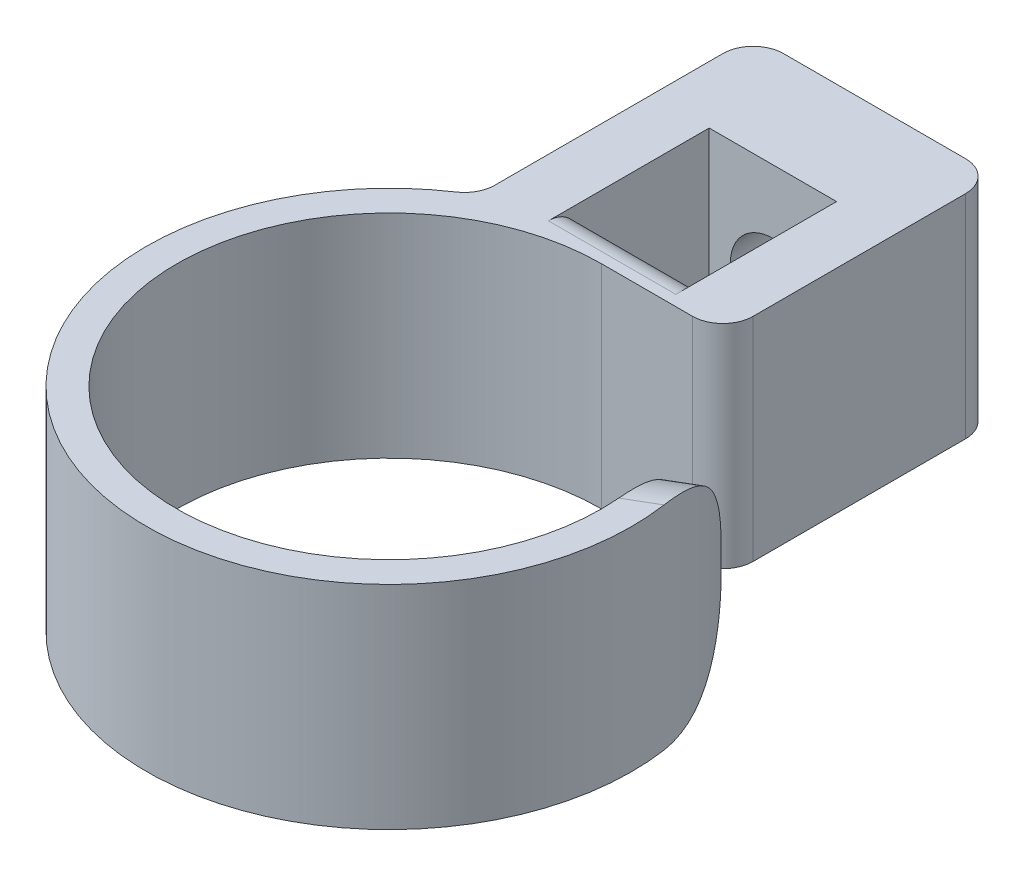
ISO-10303-21;
HEADER;
FILE_DESCRIPTION(('STEP AP214'),'2;1');
FILE_NAME('part.step','',(''),(''),'','','');
FILE_SCHEMA(('AUTOMOTIVE_DESIGN { 1 0 10303 214 1 1 1 1 }'));
ENDSEC;
DATA;
#1=APPLICATION_CONTEXT('core data for automotive mechanical design processes');
#2=APPLICATION_PROTOCOL_DEFINITION('international standard','automotive_design',2000,#1);
#3=PRODUCT_CONTEXT('',#1,'mechanical');
#4=PRODUCT('Part','Part','',(#3));
#5=PRODUCT_RELATED_PRODUCT_CATEGORY('part','',(#4));
#6=PRODUCT_DEFINITION_FORMATION('','',#4);
#7=PRODUCT_DEFINITION_CONTEXT('part definition',#1,'design');
#8=PRODUCT_DEFINITION('design','',#6,#7);
#9=PRODUCT_DEFINITION_SHAPE('','',#8);
#10=(LENGTH_UNIT() NAMED_UNIT(*) SI_UNIT(.MILLI.,.METRE.));
#11=(NAMED_UNIT(*) PLANE_ANGLE_UNIT() SI_UNIT($,.RADIAN.));
#12=(NAMED_UNIT(*) SI_UNIT($,.STERADIAN.) SOLID_ANGLE_UNIT());
#13=UNCERTAINTY_MEASURE_WITH_UNIT(LENGTH_MEASURE(1.E-05),#10,'distance_accuracy_value','');
#14=(GEOMETRIC_REPRESENTATION_CONTEXT(3) GLOBAL_UNCERTAINTY_ASSIGNED_CONTEXT((#13)) GLOBAL_UNIT_ASSIGNED_CONTEXT((#10,
#11,#12)) REPRESENTATION_CONTEXT('',''));
#15=CARTESIAN_POINT('',(0.,0.,0.));
#16=DIRECTION('',(0.,0.,1.));
#17=DIRECTION('',(1.,0.,0.));
#18=AXIS2_PLACEMENT_3D('',#15,#16,#17);
#19=CARTESIAN_POINT('',(-4.,7.,0.));
#20=DIRECTION('',(-1.,0.,0.));
#21=DIRECTION('',(0.,0.,1.));
#22=AXIS2_PLACEMENT_3D('',#19,#20,#21);
#23=PLANE('',#22);
#24=DIRECTION('',(0.,0.,-1.));
#25=VECTOR('',#24,1.);
#26=CARTESIAN_POINT('',(-4.,7.,0.));
#27=LINE('',#26,#25);
#28=CARTESIAN_POINT('',(-4.,7.,-7.48331477354788));
#29=VERTEX_POINT('',#28);
#30=CARTESIAN_POINT('',(-4.,7.,-15.));
#31=VERTEX_POINT('',#30);
#32=EDGE_CURVE('E346',#29,#31,#27,.T.);
#33=ORIENTED_EDGE('',*,*,#32,.T.);
#34=DIRECTION('',(0.,1.,0.));
#35=VECTOR('',#34,1.);
#36=CARTESIAN_POINT('',(-4.,7.,-15.));
#37=LINE('',#36,#35);
#38=CARTESIAN_POINT('',(-4.,0.,-15.));
#39=VERTEX_POINT('',#38);
#40=EDGE_CURVE('E60',#31,#39,#37,.F.);
#41=ORIENTED_EDGE('',*,*,#40,.T.);
#42=DIRECTION('',(0.,0.,-1.));
#43=VECTOR('',#42,1.);
#44=CARTESIAN_POINT('',(-4.,0.,0.));
#45=LINE('',#44,#43);
#46=CARTESIAN_POINT('',(-4.,0.,-7.48331477354788));
#47=VERTEX_POINT('',#46);
#48=EDGE_CURVE('E366',#47,#39,#45,.T.);
#49=ORIENTED_EDGE('',*,*,#48,.F.);
#50=DIRECTION('',(0.,-1.,0.));
#51=VECTOR('',#50,1.);
#52=CARTESIAN_POINT('',(-4.,7.,-7.48331477354788));
#53=LINE('',#52,#51);
#54=EDGE_CURVE('E217',#47,#29,#53,.F.);
#55=ORIENTED_EDGE('',*,*,#54,.T.);
#56=EDGE_LOOP('',(#33,#41,#49,#55));
#57=FACE_BOUND('',#56,.T.);
#58=ADVANCED_FACE('F37',(#57),#23,.T.);
#59=CARTESIAN_POINT('',(0.,7.,0.));
#60=DIRECTION('',(0.,-1.,0.));
#61=DIRECTION('',(0.,0.,-1.));
#62=AXIS2_PLACEMENT_3D('',#59,#60,#61);
#63=CYLINDRICAL_SURFACE('',#62,8.);
#64=CARTESIAN_POINT('',(0.,0.,0.));
#65=DIRECTION('',(0.,1.,0.));
#66=DIRECTION('',(0.,0.,1.));
#67=AXIS2_PLACEMENT_3D('',#64,#65,#66);
#68=CIRCLE('',#67,8.);
#69=CARTESIAN_POINT('',(-4.44444444444444,0.,-6.65183535426479));
#70=VERTEX_POINT('',#69);
#71=CARTESIAN_POINT('',(7.91759521147902,0.,-1.14528863923662));
#72=VERTEX_POINT('',#71);
#73=EDGE_CURVE('E368',#70,#72,#68,.T.);
#74=ORIENTED_EDGE('',*,*,#73,.T.);
#75=CARTESIAN_POINT('',(7.91759521147902,0.,-1.14528863923662));
#76=CARTESIAN_POINT('',(7.90560451927163,-8.44597518646428E-06,-1.2282592034002));
#77=CARTESIAN_POINT('',(7.8922862796158,0.00301990360414861,-1.31105072707906));
#78=CARTESIAN_POINT('',(7.86314843006864,0.0153242345624507,-1.47575337023933));
#79=CARTESIAN_POINT('',(7.84732790709138,0.0246025005860727,-1.55766415664088));
#80=CARTESIAN_POINT('',(7.81334222415321,0.0495853704127475,-1.72005014531417));
#81=CARTESIAN_POINT('',(7.79517623884685,0.0652922406214126,-1.8005248308355));
#82=CARTESIAN_POINT('',(7.75677064645734,0.103197911465341,-1.95938847563758));
#83=CARTESIAN_POINT('',(7.73653133689236,0.125395781499614,-2.03777773214553));
#84=CARTESIAN_POINT('',(7.67303506777772,0.201926061016213,-2.26937627416804));
#85=CARTESIAN_POINT('',(7.62706070282454,0.266152254491046,-2.41873051541854));
#86=CARTESIAN_POINT('',(7.53130184258967,0.419812529417564,-2.70221127227787));
#87=CARTESIAN_POINT('',(7.48152089426593,0.509223347529292,-2.8363516814441));
#88=CARTESIAN_POINT('',(7.3837413819207,0.707447283308147,-3.08175592960648));
#89=CARTESIAN_POINT('',(7.33574120390198,0.815475001521908,-3.1936544370113));
#90=CARTESIAN_POINT('',(7.24337195626956,1.05000762813501,-3.39796596339432));
#91=CARTESIAN_POINT('',(7.19900455337153,1.17652094441761,-3.49037006866241));
#92=CARTESIAN_POINT('',(7.11676546372199,1.44619831655572,-3.65516915309281));
#93=CARTESIAN_POINT('',(7.07898200335396,1.58955091188484,-3.7272992938227));
#94=CARTESIAN_POINT('',(7.01353544956735,1.88763361359476,-3.84904229192971));
#95=CARTESIAN_POINT('',(6.98586985321593,2.04236089474299,-3.89866071893199));
#96=CARTESIAN_POINT('',(6.94663686904038,2.33071753000599,-3.96806183101622));
#97=CARTESIAN_POINT('',(6.93307776603743,2.46318469771166,-3.99158860440259));
#98=CARTESIAN_POINT('',(6.91945848094386,2.66360334631769,-4.01511733898921));
#99=CARTESIAN_POINT('',(6.91603861956929,2.73068987571986,-4.02100001257915));
#100=CARTESIAN_POINT('',(6.91146961057915,2.86517835335375,-4.02884570916185));
#101=CARTESIAN_POINT('',(6.91032078588068,2.93258034507528,-4.03080817474343));
#102=CARTESIAN_POINT('',(6.91032396388709,3.,-4.03080918850394));
#103=B_SPLINE_CURVE_WITH_KNOTS('',3,(#75,#76,#77,#78,#79,#80,#81,#82,#83,#84,#85,#86,#87,#88,
#89,#90,#91,#92,#93,#94,#95,#96,#97,#98,#99,#100,#101,#102),.UNSPECIFIED.,.F.,.F.,(4,2,2,2,2,2,
2,2,2,2,2,2,2,4),(0.,0.251449656288062,0.502991279419703,0.754621660090573,1.00621598271583,
1.51027911472168,2.01387815592746,2.49991424044438,2.98617208296384,3.47851438379895,
3.97073480766565,4.37511974216837,4.57727649136806,4.77946198302534),.UNSPECIFIED.);
#104=CARTESIAN_POINT('',(6.91032396388709,3.,-4.03080918850394));
#105=VERTEX_POINT('',#104);
#106=EDGE_CURVE('E234',#72,#105,#103,.T.);
#107=ORIENTED_EDGE('',*,*,#106,.T.);
#108=DIRECTION('',(0.,-1.,0.));
#109=VECTOR('',#108,1.);
#110=CARTESIAN_POINT('',(6.91032396388709,7.,-4.03080918850394));
#111=LINE('',#110,#109);
#112=CARTESIAN_POINT('',(6.91032396388709,4.,-4.03080918850394));
#113=VERTEX_POINT('',#112);
#114=EDGE_CURVE('E208',#113,#105,#111,.T.);
#115=ORIENTED_EDGE('',*,*,#114,.F.);
#116=CARTESIAN_POINT('',(6.91032396388709,4.,-4.03080918850394));
#117=CARTESIAN_POINT('',(6.91031137850826,4.08426227917581,-4.03081113920035));
#118=CARTESIAN_POINT('',(6.91211243470989,4.16852071869517,-4.02774256557724));
#119=CARTESIAN_POINT('',(6.91924837651607,4.33643689676018,-4.01548179543402));
#120=CARTESIAN_POINT('',(6.92458311349776,4.42009466042004,-4.00628985645609));
#121=CARTESIAN_POINT('',(6.93868940593665,4.58618159740056,-3.98180597810101));
#122=CARTESIAN_POINT('',(6.94745922001372,4.66861137129558,-3.96651712942412));
#123=CARTESIAN_POINT('',(6.96824149904853,4.83167463586952,-3.92989176955191));
#124=CARTESIAN_POINT('',(6.98025392405773,4.9123081486649,-3.90855533286188));
#125=CARTESIAN_POINT('',(7.02082860324577,5.15074937365515,-3.83550795257462));
#126=CARTESIAN_POINT('',(7.05393310686185,5.30515230401606,-3.77475096767341));
#127=CARTESIAN_POINT('',(7.12951874198644,5.60000540940672,-3.62995656649497));
#128=CARTESIAN_POINT('',(7.17199835812645,5.74045783404537,-3.54592291203804));
#129=CARTESIAN_POINT('',(7.26262212697864,6.00267287542991,-3.35637613809782));
#130=CARTESIAN_POINT('',(7.31073182946738,6.12453963048834,-3.2509910349868));
#131=CARTESIAN_POINT('',(7.40892190573647,6.34692245867137,-3.02051547911782));
#132=CARTESIAN_POINT('',(7.45900153506728,6.44744650720505,-2.89543241769515));
#133=CARTESIAN_POINT('',(7.55600455615929,6.62230768530013,-2.63173723779388));
#134=CARTESIAN_POINT('',(7.60297461671302,6.69720884982576,-2.49351589628935));
#135=CARTESIAN_POINT('',(7.69166824187295,6.82253464076962,-2.20477100445936));
#136=CARTESIAN_POINT('',(7.73338998863164,6.87295080357158,-2.05424322119996));
#137=CARTESIAN_POINT('',(7.80106192381985,6.94104699971188,-1.7774506133603));
#138=CARTESIAN_POINT('',(7.82848719787607,6.96335751537216,-1.6526599300598));
#139=CARTESIAN_POINT('',(7.86525987483749,6.98546288789183,-1.46349489605388));
#140=CARTESIAN_POINT('',(7.87678325837459,6.99093807938176,-1.40015572193666));
#141=CARTESIAN_POINT('',(7.89832880796071,6.99820701025326,-1.2730145483506));
#142=CARTESIAN_POINT('',(7.9083510422403,7.00000091700452,-1.20921257005553));
#143=CARTESIAN_POINT('',(7.91759521147902,7.,-1.14528863923662));
#144=B_SPLINE_CURVE_WITH_KNOTS('',3,(#116,#117,#118,#119,#120,#121,#122,#123,#124,#125,#126,
#127,#128,#129,#130,#131,#132,#133,#134,#135,#136,#137,#138,#139,#140,#141,#142,#143),
.UNSPECIFIED.,.F.,.F.,(4,2,2,2,2,2,2,2,2,2,2,2,2,4),(0.,0.252704806970909,0.505398986119791,
0.7579652297711,1.01052836198312,1.51549074516878,2.02037156726487,2.52231039807672,
3.02406133140579,3.51392385134568,4.00395557947049,4.39195345043287,4.58567748827031,
4.77939271824557),.UNSPECIFIED.);
#145=CARTESIAN_POINT('',(7.91759521147902,7.,-1.14528863923662));
#146=VERTEX_POINT('',#145);
#147=EDGE_CURVE('E226',#113,#146,#144,.T.);
#148=ORIENTED_EDGE('',*,*,#147,.T.);
#149=CARTESIAN_POINT('',(0.,7.,0.));
#150=DIRECTION('',(0.,1.,0.));
#151=DIRECTION('',(0.,0.,1.));
#152=AXIS2_PLACEMENT_3D('',#149,#150,#151);
#153=CIRCLE('',#152,8.);
#154=CARTESIAN_POINT('',(-4.44444444444444,7.,-6.65183535426479));
#155=VERTEX_POINT('',#154);
#156=EDGE_CURVE('E348',#155,#146,#153,.T.);
#157=ORIENTED_EDGE('',*,*,#156,.F.);
#158=DIRECTION('',(0.,-1.,0.));
#159=VECTOR('',#158,1.);
#160=CARTESIAN_POINT('',(-4.44444444444444,7.,-6.65183535426479));
#161=LINE('',#160,#159);
#162=EDGE_CURVE('E214',#155,#70,#161,.T.);
#163=ORIENTED_EDGE('',*,*,#162,.T.);
#164=EDGE_LOOP('',(#74,#107,#115,#148,#157,#163));
#165=FACE_BOUND('',#164,.T.);
#166=ADVANCED_FACE('F244',(#165),#63,.T.);
#167=CARTESIAN_POINT('',(0.,7.,0.));
#168=DIRECTION('',(-0.503851148562993,0.,-0.863790495485886));
#169=DIRECTION('',(-0.863790495485886,0.,0.503851148562993));
#170=AXIS2_PLACEMENT_3D('',#167,#168,#169);
#171=PLANE('',#170);
#172=ORIENTED_EDGE('',*,*,#114,.T.);
#173=DIRECTION('',(0.863790495485886,0.,-0.503851148562993));
#174=VECTOR('',#173,1.);
#175=CARTESIAN_POINT('',(6.04653346840121,3.,-3.52695803994095));
#176=LINE('',#175,#174);
#177=CARTESIAN_POINT('',(6.0465334684012,3.,-3.52695803994095));
#178=VERTEX_POINT('',#177);
#179=EDGE_CURVE('E436',#105,#178,#176,.F.);
#180=ORIENTED_EDGE('',*,*,#179,.T.);
#181=DIRECTION('',(0.,-1.,0.));
#182=VECTOR('',#181,1.);
#183=CARTESIAN_POINT('',(6.0465334684012,7.,-3.52695803994095));
#184=LINE('',#183,#182);
#185=CARTESIAN_POINT('',(6.0465334684012,4.,-3.52695803994095));
#186=VERTEX_POINT('',#185);
#187=EDGE_CURVE('E197',#186,#178,#184,.T.);
#188=ORIENTED_EDGE('',*,*,#187,.F.);
#189=DIRECTION('',(0.863790495485886,0.,-0.503851148562993));
#190=VECTOR('',#189,1.);
#191=CARTESIAN_POINT('',(0.,4.,0.));
#192=LINE('',#191,#190);
#193=EDGE_CURVE('E432',#186,#113,#192,.T.);
#194=ORIENTED_EDGE('',*,*,#193,.T.);
#195=EDGE_LOOP('',(#172,#180,#188,#194));
#196=FACE_BOUND('',#195,.T.);
#197=ADVANCED_FACE('F249',(#196),#171,.T.);
#198=CARTESIAN_POINT('',(0.,7.,0.));
#199=DIRECTION('',(0.,-1.,0.));
#200=DIRECTION('',(0.,0.,-1.));
#201=AXIS2_PLACEMENT_3D('',#198,#199,#200);
#202=CYLINDRICAL_SURFACE('',#201,7.);
#203=ORIENTED_EDGE('',*,*,#187,.T.);
#204=CARTESIAN_POINT('',(6.0465334684012,3.,-3.52695803994095));
#205=CARTESIAN_POINT('',(6.04651968899642,2.91577381233204,-3.52695927340141));
#206=CARTESIAN_POINT('',(6.04832037709869,2.83155146664165,-3.52389402371262));
#207=CARTESIAN_POINT('',(6.05544854521157,2.6637065594673,-3.51164276372021));
#208=CARTESIAN_POINT('',(6.0607758832496,2.58008397397573,-3.50245699981044));
#209=CARTESIAN_POINT('',(6.0748522156717,2.41405928718471,-3.47798214491571));
#210=CARTESIAN_POINT('',(6.08359974714309,2.33165667968548,-3.46269566332101));
#211=CARTESIAN_POINT('',(6.10430507233719,2.16864604995579,-3.42606156230433));
#212=CARTESIAN_POINT('',(6.11626282638986,2.08803800556252,-3.40471401778121));
#213=CARTESIAN_POINT('',(6.15659325894473,1.84966640438453,-3.33159289936936));
#214=CARTESIAN_POINT('',(6.1894276145611,1.69530485258129,-3.27073346943398));
#215=CARTESIAN_POINT('',(6.26401554044437,1.40053740410898,-3.12549616997252));
#216=CARTESIAN_POINT('',(6.30576768238665,1.26012927784872,-3.04112206603472));
#217=CARTESIAN_POINT('',(6.39409064125079,0.998273636433291,-2.85070274959846));
#218=CARTESIAN_POINT('',(6.44062253103645,0.876690459003133,-2.74482666309982));
#219=CARTESIAN_POINT('',(6.53453520671374,0.654895171515352,-2.51305140196685));
#220=CARTESIAN_POINT('',(6.5819155198649,0.554671538397376,-2.38716308787005));
#221=CARTESIAN_POINT('',(6.67185401725637,0.380989827039486,-2.12256121370907));
#222=CARTESIAN_POINT('',(6.71451544884917,0.306805975068591,-1.9843585733528));
#223=CARTESIAN_POINT('',(6.79315248582953,0.182378579141993,-1.69571030262528));
#224=CARTESIAN_POINT('',(6.82912397274541,0.132149752841686,-1.54525721201356));
#225=CARTESIAN_POINT('',(6.8865743573531,0.0619923588617948,-1.26192520507928));
#226=CARTESIAN_POINT('',(6.90946256441025,0.0384454322266876,-1.13021087380845));
#227=CARTESIAN_POINT('',(6.93818492493484,0.0152004523818685,-0.930652793655286));
#228=CARTESIAN_POINT('',(6.94681984206951,0.00946448897318101,-0.863851239509058));
#229=CARTESIAN_POINT('',(6.96217783170972,0.00186421966483841,-0.72981864760137));
#230=CARTESIAN_POINT('',(6.96890119852208,-6.82511476698765E-07,-0.662587677585288));
#231=CARTESIAN_POINT('',(6.97464421957056,0.,-0.595262975844205));
#232=B_SPLINE_CURVE_WITH_KNOTS('',3,(#204,#205,#206,#207,#208,#209,#210,#211,#212,#213,#214,
#215,#216,#217,#218,#219,#220,#221,#222,#223,#224,#225,#226,#227,#228,#229,#230,#231),
.UNSPECIFIED.,.F.,.F.,(4,2,2,2,2,2,2,2,2,2,2,2,2,4),(0.,0.252596621915931,0.505183075650633,
0.757661609054684,1.01013702262077,1.51493600459165,2.01965419556458,2.52054637711852,
3.02116764915697,3.5064555157241,3.99204115395302,4.39798825182426,4.60066959443342,
4.8033197148227),.UNSPECIFIED.);
#233=CARTESIAN_POINT('',(6.97464421957056,0.,-0.595262975844205));
#234=VERTEX_POINT('',#233);
#235=EDGE_CURVE('E283',#178,#234,#232,.T.);
#236=ORIENTED_EDGE('',*,*,#235,.T.);
#237=CARTESIAN_POINT('',(0.,0.,0.));
#238=DIRECTION('',(0.,1.,0.));
#239=DIRECTION('',(0.,0.,1.));
#240=AXIS2_PLACEMENT_3D('',#237,#238,#239);
#241=CIRCLE('',#240,7.);
#242=CARTESIAN_POINT('',(0.,0.,-7.));
#243=VERTEX_POINT('',#242);
#244=EDGE_CURVE('E371',#243,#234,#241,.T.);
#245=ORIENTED_EDGE('',*,*,#244,.F.);
#246=DIRECTION('',(0.,-1.,0.));
#247=VECTOR('',#246,1.);
#248=CARTESIAN_POINT('',(0.,7.,-7.));
#249=LINE('',#248,#247);
#250=CARTESIAN_POINT('',(0.,7.,-7.));
#251=VERTEX_POINT('',#250);
#252=EDGE_CURVE('E194',#251,#243,#249,.T.);
#253=ORIENTED_EDGE('',*,*,#252,.F.);
#254=CARTESIAN_POINT('',(0.,7.,0.));
#255=DIRECTION('',(0.,1.,0.));
#256=DIRECTION('',(0.,0.,1.));
#257=AXIS2_PLACEMENT_3D('',#254,#255,#256);
#258=CIRCLE('',#257,7.);
#259=CARTESIAN_POINT('',(6.97464421957056,7.,-0.595262975844204));
#260=VERTEX_POINT('',#259);
#261=EDGE_CURVE('E351',#251,#260,#258,.T.);
#262=ORIENTED_EDGE('',*,*,#261,.T.);
#263=CARTESIAN_POINT('',(6.97464421957056,7.,-0.595262975844205));
#264=CARTESIAN_POINT('',(6.96754128521734,7.00000933953335,-0.678634058521399));
#265=CARTESIAN_POINT('',(6.95891745769304,6.99714268022733,-0.761894622979223));
#266=CARTESIAN_POINT('',(6.93875693526301,6.98542217491795,-0.927675270569818));
#267=CARTESIAN_POINT('',(6.92721886676495,6.97656550228216,-1.01019498546576));
#268=CARTESIAN_POINT('',(6.90135626412383,6.95262055723209,-1.17395470485087));
#269=CARTESIAN_POINT('',(6.88702969320848,6.93752772070847,-1.25519372672642));
#270=CARTESIAN_POINT('',(6.85583226348858,6.90096604418968,-1.4157134675973));
#271=CARTESIAN_POINT('',(6.83896185424422,6.87949833014716,-1.49499452973794));
#272=CARTESIAN_POINT('',(6.80292771182781,6.83004421828268,-1.65124912471061));
#273=CARTESIAN_POINT('',(6.7837570086493,6.80203775224553,-1.72821471310743));
#274=CARTESIAN_POINT('',(6.74354675912736,6.73956586804792,-1.87900759448935));
#275=CARTESIAN_POINT('',(6.72250651139951,6.70509802038705,-1.95283369416463));
#276=CARTESIAN_POINT('',(6.67904872366719,6.62989397013035,-2.09664989016569));
#277=CARTESIAN_POINT('',(6.65663332523751,6.58916737276534,-2.16664564534354));
#278=CARTESIAN_POINT('',(6.61089797486702,6.50163952777625,-2.30242732443842));
#279=CARTESIAN_POINT('',(6.58757769409511,6.45483605706395,-2.36821169449988));
#280=CARTESIAN_POINT('',(6.51917958792265,6.31022499609289,-2.55282999559099));
#281=CARTESIAN_POINT('',(6.47357984430878,6.20470532845477,-2.66557286126563));
#282=CARTESIAN_POINT('',(6.38482902156049,5.97535201374407,-2.87169374954025));
#283=CARTESIAN_POINT('',(6.34167925050059,5.85150870832136,-2.96506149681966));
#284=CARTESIAN_POINT('',(6.26080922737581,5.58692851003832,-3.13225646896249));
#285=CARTESIAN_POINT('',(6.2231780060728,5.4459702552957,-3.2057766296613));
#286=CARTESIAN_POINT('',(6.15729527220903,5.15253249448644,-3.3305741409755));
#287=CARTESIAN_POINT('',(6.1290423986124,5.00005466414838,-3.38185471944911));
#288=CARTESIAN_POINT('',(6.08704363595518,4.7069818227865,-3.45680563194983));
#289=CARTESIAN_POINT('',(6.07193457343293,4.56725343533064,-3.48310861174037));
#290=CARTESIAN_POINT('',(6.05674010685726,4.35561144420202,-3.50941439057677));
#291=CARTESIAN_POINT('',(6.05292013071305,4.28471527032902,-3.51599153506125));
#292=CARTESIAN_POINT('',(6.04781458670757,4.14255348535416,-3.52476263611146));
#293=CARTESIAN_POINT('',(6.04652930114068,4.07128783398882,-3.52695610445736));
#294=CARTESIAN_POINT('',(6.0465334684012,4.,-3.52695803994095));
#295=B_SPLINE_CURVE_WITH_KNOTS('',3,(#263,#264,#265,#266,#267,#268,#269,#270,#271,#272,#273,
#274,#275,#276,#277,#278,#279,#280,#281,#282,#283,#284,#285,#286,#287,#288,#289,#290,#291,#292,
#293,#294),.UNSPECIFIED.,.F.,.F.,(4,2,2,2,2,2,2,2,2,2,2,2,2,2,2,4),(0.,0.250984663545138,
0.502087847167247,0.753375134054225,1.00461806409414,1.25664246771676,1.50876182409552,
1.76049805016655,2.01232662915859,2.4929035788159,2.97373474796966,3.46162642460223,
3.94944726480368,4.3768612876265,4.59061154707601,4.80438561104408),.UNSPECIFIED.);
#296=EDGE_CURVE('E291',#260,#186,#295,.T.);
#297=ORIENTED_EDGE('',*,*,#296,.T.);
#298=EDGE_LOOP('',(#203,#236,#245,#253,#262,#297));
#299=FACE_BOUND('',#298,.T.);
#300=ADVANCED_FACE('F298',(#299),#202,.F.);
#301=CARTESIAN_POINT('',(0.,7.,-7.));
#302=DIRECTION('',(0.,0.,-1.));
#303=DIRECTION('',(-1.,0.,0.));
#304=AXIS2_PLACEMENT_3D('',#301,#302,#303);
#305=PLANE('',#304);
#306=DIRECTION('',(1.,0.,0.));
#307=VECTOR('',#306,1.);
#308=CARTESIAN_POINT('',(0.,0.,-7.));
#309=LINE('',#308,#307);
#310=CARTESIAN_POINT('',(3.,0.,-7.));
#311=VERTEX_POINT('',#310);
#312=EDGE_CURVE('E374',#243,#311,#309,.T.);
#313=ORIENTED_EDGE('',*,*,#312,.T.);
#314=DIRECTION('',(0.,-1.,0.));
#315=VECTOR('',#314,1.);
#316=CARTESIAN_POINT('',(3.,7.,-7.));
#317=LINE('',#316,#315);
#318=CARTESIAN_POINT('',(3.,7.,-7.));
#319=VERTEX_POINT('',#318);
#320=EDGE_CURVE('E210',#311,#319,#317,.F.);
#321=ORIENTED_EDGE('',*,*,#320,.T.);
#322=DIRECTION('',(1.,0.,0.));
#323=VECTOR('',#322,1.);
#324=CARTESIAN_POINT('',(0.,7.,-7.));
#325=LINE('',#324,#323);
#326=EDGE_CURVE('E354',#251,#319,#325,.T.);
#327=ORIENTED_EDGE('',*,*,#326,.F.);
#328=ORIENTED_EDGE('',*,*,#252,.T.);
#329=EDGE_LOOP('',(#313,#321,#327,#328));
#330=FACE_BOUND('',#329,.T.);
#331=ADVANCED_FACE('F302',(#330),#305,.F.);
#332=CARTESIAN_POINT('',(4.,7.,0.));
#333=DIRECTION('',(-1.,0.,0.));
#334=DIRECTION('',(0.,0.,1.));
#335=AXIS2_PLACEMENT_3D('',#332,#333,#334);
#336=PLANE('',#335);
#337=DIRECTION('',(0.,0.,-1.));
#338=VECTOR('',#337,1.);
#339=CARTESIAN_POINT('',(4.,0.,0.));
#340=LINE('',#339,#338);
#341=CARTESIAN_POINT('',(4.,0.,-8.));
#342=VERTEX_POINT('',#341);
#343=CARTESIAN_POINT('',(4.,0.,-15.));
#344=VERTEX_POINT('',#343);
#345=EDGE_CURVE('E189',#342,#344,#340,.T.);
#346=ORIENTED_EDGE('',*,*,#345,.T.);
#347=DIRECTION('',(0.,-1.,0.));
#348=VECTOR('',#347,1.);
#349=CARTESIAN_POINT('',(4.,7.,-15.));
#350=LINE('',#349,#348);
#351=CARTESIAN_POINT('',(4.,7.,-15.));
#352=VERTEX_POINT('',#351);
#353=EDGE_CURVE('E11',#344,#352,#350,.F.);
#354=ORIENTED_EDGE('',*,*,#353,.T.);
#355=DIRECTION('',(0.,0.,-1.));
#356=VECTOR('',#355,1.);
#357=CARTESIAN_POINT('',(4.,7.,0.));
#358=LINE('',#357,#356);
#359=CARTESIAN_POINT('',(4.,7.,-8.));
#360=VERTEX_POINT('',#359);
#361=EDGE_CURVE('E357',#360,#352,#358,.T.);
#362=ORIENTED_EDGE('',*,*,#361,.F.);
#363=DIRECTION('',(0.,-1.,0.));
#364=VECTOR('',#363,1.);
#365=CARTESIAN_POINT('',(4.,7.,-8.));
#366=LINE('',#365,#364);
#367=EDGE_CURVE('E204',#360,#342,#366,.T.);
#368=ORIENTED_EDGE('',*,*,#367,.T.);
#369=EDGE_LOOP('',(#346,#354,#362,#368));
#370=FACE_BOUND('',#369,.T.);
#371=ADVANCED_FACE('F267',(#370),#336,.F.);
#372=CARTESIAN_POINT('',(0.,7.,-12.65));
#373=DIRECTION('',(0.,0.,-1.));
#374=DIRECTION('',(-1.,0.,0.));
#375=AXIS2_PLACEMENT_3D('',#372,#373,#374);
#376=PLANE('',#375);
#377=CARTESIAN_POINT('',(0.,3.5,-12.65));
#378=DIRECTION('',(0.,0.,-1.));
#379=DIRECTION('',(-1.,0.,0.));
#380=AXIS2_PLACEMENT_3D('',#377,#378,#379);
#381=CIRCLE('',#380,1.4);
#382=CARTESIAN_POINT('',(-1.4,3.5,-12.65));
#383=VERTEX_POINT('',#382);
#384=EDGE_CURVE('E335',#383,#383,#381,.T.);
#385=ORIENTED_EDGE('',*,*,#384,.T.);
#386=EDGE_LOOP('',(#385));
#387=FACE_BOUND('',#386,.T.);
#388=DIRECTION('',(1.,0.,0.));
#389=VECTOR('',#388,1.);
#390=CARTESIAN_POINT('',(0.,0.,-12.65));
#391=LINE('',#390,#389);
#392=CARTESIAN_POINT('',(-2.1,0.,-12.65));
#393=VERTEX_POINT('',#392);
#394=CARTESIAN_POINT('',(2.1,0.,-12.65));
#395=VERTEX_POINT('',#394);
#396=EDGE_CURVE('E193',#393,#395,#391,.T.);
#397=ORIENTED_EDGE('',*,*,#396,.T.);
#398=DIRECTION('',(0.,-1.,0.));
#399=VECTOR('',#398,1.);
#400=CARTESIAN_POINT('',(2.1,7.,-12.65));
#401=LINE('',#400,#399);
#402=CARTESIAN_POINT('',(2.1,7.,-12.65));
#403=VERTEX_POINT('',#402);
#404=EDGE_CURVE('E174',#403,#395,#401,.T.);
#405=ORIENTED_EDGE('',*,*,#404,.F.);
#406=DIRECTION('',(1.,0.,0.));
#407=VECTOR('',#406,1.);
#408=CARTESIAN_POINT('',(0.,7.,-12.65));
#409=LINE('',#408,#407);
#410=CARTESIAN_POINT('',(-2.1,7.,-12.65));
#411=VERTEX_POINT('',#410);
#412=EDGE_CURVE('E182',#411,#403,#409,.T.);
#413=ORIENTED_EDGE('',*,*,#412,.F.);
#414=DIRECTION('',(0.,-1.,0.));
#415=VECTOR('',#414,1.);
#416=CARTESIAN_POINT('',(-2.1,7.,-12.65));
#417=LINE('',#416,#415);
#418=EDGE_CURVE('E360',#411,#393,#417,.T.);
#419=ORIENTED_EDGE('',*,*,#418,.T.);
#420=EDGE_LOOP('',(#397,#405,#413,#419));
#421=FACE_BOUND('',#420,.T.);
#422=ADVANCED_FACE('F191',(#387,#421),#376,.F.);
#423=CARTESIAN_POINT('',(2.1,7.,0.));
#424=DIRECTION('',(1.,0.,0.));
#425=DIRECTION('',(0.,0.,-1.));
#426=AXIS2_PLACEMENT_3D('',#423,#424,#425);
#427=PLANE('',#426);
#428=DIRECTION('',(0.,0.,1.));
#429=VECTOR('',#428,1.);
#430=CARTESIAN_POINT('',(2.1,0.,0.));
#431=LINE('',#430,#429);
#432=CARTESIAN_POINT('',(2.1,0.,-7.35));
#433=VERTEX_POINT('',#432);
#434=EDGE_CURVE('E362',#395,#433,#431,.T.);
#435=ORIENTED_EDGE('',*,*,#434,.T.);
#436=CARTESIAN_POINT('',(2.1,1.,-7.35));
#437=DIRECTION('',(1.,0.,0.));
#438=DIRECTION('',(0.,0.,-1.));
#439=AXIS2_PLACEMENT_3D('',#436,#437,#438);
#440=CIRCLE('',#439,1.);
#441=CARTESIAN_POINT('',(2.1,1.,-8.35));
#442=VERTEX_POINT('',#441);
#443=EDGE_CURVE('E400',#433,#442,#440,.T.);
#444=ORIENTED_EDGE('',*,*,#443,.T.);
#445=DIRECTION('',(0.,-1.,0.));
#446=VECTOR('',#445,1.);
#447=CARTESIAN_POINT('',(2.1,7.,-8.35));
#448=LINE('',#447,#446);
#449=CARTESIAN_POINT('',(2.1,6.,-8.35));
#450=VERTEX_POINT('',#449);
#451=EDGE_CURVE('E195',#450,#442,#448,.T.);
#452=ORIENTED_EDGE('',*,*,#451,.F.);
#453=CARTESIAN_POINT('',(2.1,6.,-7.35));
#454=DIRECTION('',(1.,0.,0.));
#455=DIRECTION('',(0.,0.,-1.));
#456=AXIS2_PLACEMENT_3D('',#453,#454,#455);
#457=CIRCLE('',#456,1.);
#458=CARTESIAN_POINT('',(2.1,7.,-7.35));
#459=VERTEX_POINT('',#458);
#460=EDGE_CURVE('E177',#450,#459,#457,.T.);
#461=ORIENTED_EDGE('',*,*,#460,.T.);
#462=DIRECTION('',(0.,0.,1.));
#463=VECTOR('',#462,1.);
#464=CARTESIAN_POINT('',(2.1,7.,0.));
#465=LINE('',#464,#463);
#466=EDGE_CURVE('E170',#403,#459,#465,.T.);
#467=ORIENTED_EDGE('',*,*,#466,.F.);
#468=ORIENTED_EDGE('',*,*,#404,.T.);
#469=EDGE_LOOP('',(#435,#444,#452,#461,#467,#468));
#470=FACE_BOUND('',#469,.T.);
#471=ADVANCED_FACE('F172',(#470),#427,.F.);
#472=CARTESIAN_POINT('',(0.,7.,-8.35));
#473=DIRECTION('',(0.,0.,-1.));
#474=DIRECTION('',(-1.,0.,0.));
#475=AXIS2_PLACEMENT_3D('',#472,#473,#474);
#476=PLANE('',#475);
#477=DIRECTION('',(0.,-1.,0.));
#478=VECTOR('',#477,1.);
#479=CARTESIAN_POINT('',(-2.1,7.,-8.35));
#480=LINE('',#479,#478);
#481=CARTESIAN_POINT('',(-2.1,6.,-8.35));
#482=VERTEX_POINT('',#481);
#483=CARTESIAN_POINT('',(-2.1,1.,-8.35));
#484=VERTEX_POINT('',#483);
#485=EDGE_CURVE('E200',#482,#484,#480,.T.);
#486=ORIENTED_EDGE('',*,*,#485,.F.);
#487=DIRECTION('',(1.,0.,0.));
#488=VECTOR('',#487,1.);
#489=CARTESIAN_POINT('',(0.,6.,-8.35));
#490=LINE('',#489,#488);
#491=EDGE_CURVE('E444',#482,#450,#490,.T.);
#492=ORIENTED_EDGE('',*,*,#491,.T.);
#493=ORIENTED_EDGE('',*,*,#451,.T.);
#494=DIRECTION('',(1.,0.,0.));
#495=VECTOR('',#494,1.);
#496=CARTESIAN_POINT('',(-2.1,1.,-8.35));
#497=LINE('',#496,#495);
#498=EDGE_CURVE('E396',#442,#484,#497,.F.);
#499=ORIENTED_EDGE('',*,*,#498,.T.);
#500=EDGE_LOOP('',(#486,#492,#493,#499));
#501=FACE_BOUND('',#500,.T.);
#502=ADVANCED_FACE('F258',(#501),#476,.T.);
#503=CARTESIAN_POINT('',(-2.1,7.,0.));
#504=DIRECTION('',(1.,0.,0.));
#505=DIRECTION('',(0.,0.,-1.));
#506=AXIS2_PLACEMENT_3D('',#503,#504,#505);
#507=PLANE('',#506);
#508=DIRECTION('',(0.,0.,1.));
#509=VECTOR('',#508,1.);
#510=CARTESIAN_POINT('',(-2.1,0.,0.));
#511=LINE('',#510,#509);
#512=CARTESIAN_POINT('',(-2.1,0.,-7.35));
#513=VERTEX_POINT('',#512);
#514=EDGE_CURVE('E364',#393,#513,#511,.T.);
#515=ORIENTED_EDGE('',*,*,#514,.F.);
#516=ORIENTED_EDGE('',*,*,#418,.F.);
#517=DIRECTION('',(0.,0.,1.));
#518=VECTOR('',#517,1.);
#519=CARTESIAN_POINT('',(-2.1,7.,0.));
#520=LINE('',#519,#518);
#521=CARTESIAN_POINT('',(-2.1,7.,-7.35));
#522=VERTEX_POINT('',#521);
#523=EDGE_CURVE('E181',#411,#522,#520,.T.);
#524=ORIENTED_EDGE('',*,*,#523,.T.);
#525=CARTESIAN_POINT('',(-2.1,6.,-7.35));
#526=DIRECTION('',(1.,0.,0.));
#527=DIRECTION('',(0.,0.,-1.));
#528=AXIS2_PLACEMENT_3D('',#525,#526,#527);
#529=CIRCLE('',#528,1.);
#530=EDGE_CURVE('E390',#522,#482,#529,.F.);
#531=ORIENTED_EDGE('',*,*,#530,.T.);
#532=ORIENTED_EDGE('',*,*,#485,.T.);
#533=CARTESIAN_POINT('',(-2.1,1.,-7.35));
#534=DIRECTION('',(1.,0.,0.));
#535=DIRECTION('',(0.,0.,-1.));
#536=AXIS2_PLACEMENT_3D('',#533,#534,#535);
#537=CIRCLE('',#536,1.);
#538=EDGE_CURVE('E387',#484,#513,#537,.F.);
#539=ORIENTED_EDGE('',*,*,#538,.T.);
#540=EDGE_LOOP('',(#515,#516,#524,#531,#532,#539));
#541=FACE_BOUND('',#540,.T.);
#542=ADVANCED_FACE('F255',(#541),#507,.T.);
#543=CARTESIAN_POINT('',(0.,7.,0.));
#544=DIRECTION('',(0.,1.,0.));
#545=DIRECTION('',(0.,0.,1.));
#546=AXIS2_PLACEMENT_3D('',#543,#544,#545);
#547=PLANE('',#546);
#548=ORIENTED_EDGE('',*,*,#466,.T.);
#549=DIRECTION('',(1.,0.,0.));
#550=VECTOR('',#549,1.);
#551=CARTESIAN_POINT('',(0.,7.,-7.35));
#552=LINE('',#551,#550);
#553=EDGE_CURVE('E445',#459,#522,#552,.F.);
#554=ORIENTED_EDGE('',*,*,#553,.T.);
#555=ORIENTED_EDGE('',*,*,#523,.F.);
#556=ORIENTED_EDGE('',*,*,#412,.T.);
#557=EDGE_LOOP('',(#548,#554,#555,#556));
#558=FACE_BOUND('',#557,.T.);
#559=DIRECTION('',(1.,0.,0.));
#560=VECTOR('',#559,1.);
#561=CARTESIAN_POINT('',(4.,7.,-16.));
#562=LINE('',#561,#560);
#563=CARTESIAN_POINT('',(-3.,7.,-16.));
#564=VERTEX_POINT('',#563);
#565=CARTESIAN_POINT('',(3.,7.,-16.));
#566=VERTEX_POINT('',#565);
#567=EDGE_CURVE('E339',#564,#566,#562,.T.);
#568=ORIENTED_EDGE('',*,*,#567,.F.);
#569=CARTESIAN_POINT('',(-3.,7.,-15.));
#570=DIRECTION('',(0.,1.,0.));
#571=DIRECTION('',(0.,0.,1.));
#572=AXIS2_PLACEMENT_3D('',#569,#570,#571);
#573=CIRCLE('',#572,1.);
#574=EDGE_CURVE('E412',#564,#31,#573,.T.);
#575=ORIENTED_EDGE('',*,*,#574,.T.);
#576=ORIENTED_EDGE('',*,*,#32,.F.);
#577=CARTESIAN_POINT('',(-5.,7.,-7.48331477354788));
#578=DIRECTION('',(0.,1.,0.));
#579=DIRECTION('',(0.,0.,1.));
#580=AXIS2_PLACEMENT_3D('',#577,#578,#579);
#581=CIRCLE('',#580,1.);
#582=EDGE_CURVE('E221',#29,#155,#581,.F.);
#583=ORIENTED_EDGE('',*,*,#582,.T.);
#584=ORIENTED_EDGE('',*,*,#156,.T.);
#585=DIRECTION('',(0.863790495485886,0.,-0.503851148562993));
#586=VECTOR('',#585,1.);
#587=CARTESIAN_POINT('',(1.51155344568898,7.,2.59137148645766));
#588=LINE('',#587,#586);
#589=EDGE_CURVE('E290',#146,#260,#588,.F.);
#590=ORIENTED_EDGE('',*,*,#589,.T.);
#591=ORIENTED_EDGE('',*,*,#261,.F.);
#592=ORIENTED_EDGE('',*,*,#326,.T.);
#593=CARTESIAN_POINT('',(3.,7.,-8.));
#594=DIRECTION('',(0.,1.,0.));
#595=DIRECTION('',(0.,0.,1.));
#596=AXIS2_PLACEMENT_3D('',#593,#594,#595);
#597=CIRCLE('',#596,1.);
#598=EDGE_CURVE('E212',#319,#360,#597,.T.);
#599=ORIENTED_EDGE('',*,*,#598,.T.);
#600=ORIENTED_EDGE('',*,*,#361,.T.);
#601=CARTESIAN_POINT('',(3.,7.,-15.));
#602=DIRECTION('',(0.,1.,0.));
#603=DIRECTION('',(0.,0.,1.));
#604=AXIS2_PLACEMENT_3D('',#601,#602,#603);
#605=CIRCLE('',#604,1.);
#606=EDGE_CURVE('E410',#352,#566,#605,.T.);
#607=ORIENTED_EDGE('',*,*,#606,.T.);
#608=EDGE_LOOP('',(#568,#575,#576,#583,#584,#590,#591,#592,#599,#600,#607));
#609=FACE_BOUND('',#608,.T.);
#610=ADVANCED_FACE('F186',(#558,#609),#547,.T.);
#611=CARTESIAN_POINT('',(0.,0.,0.));
#612=DIRECTION('',(0.,1.,0.));
#613=DIRECTION('',(0.,0.,1.));
#614=AXIS2_PLACEMENT_3D('',#611,#612,#613);
#615=PLANE('',#614);
#616=DIRECTION('',(1.,0.,0.));
#617=VECTOR('',#616,1.);
#618=CARTESIAN_POINT('',(2.1,0.,-7.35));
#619=LINE('',#618,#617);
#620=EDGE_CURVE('E398',#513,#433,#619,.T.);
#621=ORIENTED_EDGE('',*,*,#620,.T.);
#622=ORIENTED_EDGE('',*,*,#434,.F.);
#623=ORIENTED_EDGE('',*,*,#396,.F.);
#624=ORIENTED_EDGE('',*,*,#514,.T.);
#625=EDGE_LOOP('',(#621,#622,#623,#624));
#626=FACE_BOUND('',#625,.T.);
#627=ORIENTED_EDGE('',*,*,#48,.T.);
#628=CARTESIAN_POINT('',(-3.,0.,-15.));
#629=DIRECTION('',(0.,1.,0.));
#630=DIRECTION('',(0.,0.,1.));
#631=AXIS2_PLACEMENT_3D('',#628,#629,#630);
#632=CIRCLE('',#631,1.);
#633=CARTESIAN_POINT('',(-3.,0.,-16.));
#634=VERTEX_POINT('',#633);
#635=EDGE_CURVE('E45',#39,#634,#632,.F.);
#636=ORIENTED_EDGE('',*,*,#635,.T.);
#637=DIRECTION('',(-1.,0.,0.));
#638=VECTOR('',#637,1.);
#639=CARTESIAN_POINT('',(4.,0.,-16.));
#640=LINE('',#639,#638);
#641=CARTESIAN_POINT('',(3.,0.,-16.));
#642=VERTEX_POINT('',#641);
#643=EDGE_CURVE('E336',#642,#634,#640,.T.);
#644=ORIENTED_EDGE('',*,*,#643,.F.);
#645=CARTESIAN_POINT('',(3.,0.,-15.));
#646=DIRECTION('',(0.,1.,0.));
#647=DIRECTION('',(0.,0.,1.));
#648=AXIS2_PLACEMENT_3D('',#645,#646,#647);
#649=CIRCLE('',#648,1.);
#650=EDGE_CURVE('E52',#642,#344,#649,.F.);
#651=ORIENTED_EDGE('',*,*,#650,.T.);
#652=ORIENTED_EDGE('',*,*,#345,.F.);
#653=CARTESIAN_POINT('',(3.,0.,-8.));
#654=DIRECTION('',(0.,1.,0.));
#655=DIRECTION('',(0.,0.,1.));
#656=AXIS2_PLACEMENT_3D('',#653,#654,#655);
#657=CIRCLE('',#656,1.);
#658=EDGE_CURVE('E207',#342,#311,#657,.F.);
#659=ORIENTED_EDGE('',*,*,#658,.T.);
#660=ORIENTED_EDGE('',*,*,#312,.F.);
#661=ORIENTED_EDGE('',*,*,#244,.T.);
#662=DIRECTION('',(0.863790495485886,0.,-0.503851148562993));
#663=VECTOR('',#662,1.);
#664=CARTESIAN_POINT('',(8.42187740957607,0.,-1.43943770204628));
#665=LINE('',#664,#663);
#666=EDGE_CURVE('E223',#234,#72,#665,.T.);
#667=ORIENTED_EDGE('',*,*,#666,.T.);
#668=ORIENTED_EDGE('',*,*,#73,.F.);
#669=CARTESIAN_POINT('',(-5.,0.,-7.48331477354788));
#670=DIRECTION('',(0.,1.,0.));
#671=DIRECTION('',(0.,0.,1.));
#672=AXIS2_PLACEMENT_3D('',#669,#670,#671);
#673=CIRCLE('',#672,1.);
#674=EDGE_CURVE('E219',#70,#47,#673,.T.);
#675=ORIENTED_EDGE('',*,*,#674,.T.);
#676=EDGE_LOOP('',(#627,#636,#644,#651,#652,#659,#660,#661,#667,#668,#675));
#677=FACE_BOUND('',#676,.T.);
#678=ADVANCED_FACE('F273',(#626,#677),#615,.F.);
#679=CARTESIAN_POINT('',(3.,7.,-8.));
#680=DIRECTION('',(0.,-1.,0.));
#681=DIRECTION('',(0.,0.,-1.));
#682=AXIS2_PLACEMENT_3D('',#679,#680,#681);
#683=CYLINDRICAL_SURFACE('',#682,1.);
#684=ORIENTED_EDGE('',*,*,#598,.F.);
#685=ORIENTED_EDGE('',*,*,#320,.F.);
#686=ORIENTED_EDGE('',*,*,#658,.F.);
#687=ORIENTED_EDGE('',*,*,#367,.F.);
#688=EDGE_LOOP('',(#684,#685,#686,#687));
#689=FACE_BOUND('',#688,.T.);
#690=ADVANCED_FACE('F269',(#689),#683,.T.);
#691=CARTESIAN_POINT('',(-5.,7.,-7.48331477354788));
#692=DIRECTION('',(0.,-1.,0.));
#693=DIRECTION('',(0.,0.,-1.));
#694=AXIS2_PLACEMENT_3D('',#691,#692,#693);
#695=CYLINDRICAL_SURFACE('',#694,1.);
#696=ORIENTED_EDGE('',*,*,#582,.F.);
#697=ORIENTED_EDGE('',*,*,#54,.F.);
#698=ORIENTED_EDGE('',*,*,#674,.F.);
#699=ORIENTED_EDGE('',*,*,#162,.F.);
#700=EDGE_LOOP('',(#696,#697,#698,#699));
#701=FACE_BOUND('',#700,.T.);
#702=ADVANCED_FACE('F272',(#701),#695,.F.);
#703=CARTESIAN_POINT('',(1.51155344568898,3.,2.59137148645766));
#704=DIRECTION('',(-0.863790495485886,0.,0.503851148562993));
#705=DIRECTION('',(0.503851148562993,0.,0.863790495485886));
#706=AXIS2_PLACEMENT_3D('',#703,#704,#705);
#707=CYLINDRICAL_SURFACE('',#706,3.);
#708=ORIENTED_EDGE('',*,*,#235,.F.);
#709=ORIENTED_EDGE('',*,*,#179,.F.);
#710=ORIENTED_EDGE('',*,*,#106,.F.);
#711=ORIENTED_EDGE('',*,*,#666,.F.);
#712=EDGE_LOOP('',(#708,#709,#710,#711));
#713=FACE_BOUND('',#712,.T.);
#714=ADVANCED_FACE('F276',(#713),#707,.T.);
#715=CARTESIAN_POINT('',(1.51155344568898,4.,2.59137148645766));
#716=DIRECTION('',(0.863790495485886,0.,-0.503851148562993));
#717=DIRECTION('',(-0.503851148562993,0.,-0.863790495485886));
#718=AXIS2_PLACEMENT_3D('',#715,#716,#717);
#719=CYLINDRICAL_SURFACE('',#718,3.);
#720=ORIENTED_EDGE('',*,*,#296,.F.);
#721=ORIENTED_EDGE('',*,*,#589,.F.);
#722=ORIENTED_EDGE('',*,*,#147,.F.);
#723=ORIENTED_EDGE('',*,*,#193,.F.);
#724=EDGE_LOOP('',(#720,#721,#722,#723));
#725=FACE_BOUND('',#724,.T.);
#726=ADVANCED_FACE('F241',(#725),#719,.T.);
#727=CARTESIAN_POINT('',(0.,6.,-7.35));
#728=DIRECTION('',(1.,0.,0.));
#729=DIRECTION('',(0.,0.,-1.));
#730=AXIS2_PLACEMENT_3D('',#727,#728,#729);
#731=CYLINDRICAL_SURFACE('',#730,1.);
#732=ORIENTED_EDGE('',*,*,#530,.F.);
#733=ORIENTED_EDGE('',*,*,#553,.F.);
#734=ORIENTED_EDGE('',*,*,#460,.F.);
#735=ORIENTED_EDGE('',*,*,#491,.F.);
#736=EDGE_LOOP('',(#732,#733,#734,#735));
#737=FACE_BOUND('',#736,.T.);
#738=ADVANCED_FACE('F451',(#737),#731,.T.);
#739=CARTESIAN_POINT('',(0.,1.,-7.35));
#740=DIRECTION('',(-1.,0.,0.));
#741=DIRECTION('',(0.,0.,1.));
#742=AXIS2_PLACEMENT_3D('',#739,#740,#741);
#743=CYLINDRICAL_SURFACE('',#742,1.);
#744=ORIENTED_EDGE('',*,*,#538,.F.);
#745=ORIENTED_EDGE('',*,*,#498,.F.);
#746=ORIENTED_EDGE('',*,*,#443,.F.);
#747=ORIENTED_EDGE('',*,*,#620,.F.);
#748=EDGE_LOOP('',(#744,#745,#746,#747));
#749=FACE_BOUND('',#748,.T.);
#750=ADVANCED_FACE('F320',(#749),#743,.T.);
#751=CARTESIAN_POINT('',(0.,0.,-16.));
#752=DIRECTION('',(0.,0.,-1.));
#753=DIRECTION('',(-1.,0.,0.));
#754=AXIS2_PLACEMENT_3D('',#751,#752,#753);
#755=PLANE('',#754);
#756=CARTESIAN_POINT('',(0.,3.5,-16.));
#757=DIRECTION('',(0.,0.,-1.));
#758=DIRECTION('',(-1.,0.,0.));
#759=AXIS2_PLACEMENT_3D('',#756,#757,#758);
#760=CIRCLE('',#759,1.4);
#761=CARTESIAN_POINT('',(-1.4,3.5,-16.));
#762=VERTEX_POINT('',#761);
#763=EDGE_CURVE('E332',#762,#762,#760,.T.);
#764=ORIENTED_EDGE('',*,*,#763,.F.);
#765=EDGE_LOOP('',(#764));
#766=FACE_BOUND('',#765,.T.);
#767=ORIENTED_EDGE('',*,*,#643,.T.);
#768=DIRECTION('',(0.,1.,0.));
#769=VECTOR('',#768,1.);
#770=CARTESIAN_POINT('',(-3.,0.,-16.));
#771=LINE('',#770,#769);
#772=EDGE_CURVE('E403',#634,#564,#771,.T.);
#773=ORIENTED_EDGE('',*,*,#772,.T.);
#774=ORIENTED_EDGE('',*,*,#567,.T.);
#775=DIRECTION('',(0.,-1.,0.));
#776=VECTOR('',#775,1.);
#777=CARTESIAN_POINT('',(3.,0.,-16.));
#778=LINE('',#777,#776);
#779=EDGE_CURVE('E399',#566,#642,#778,.T.);
#780=ORIENTED_EDGE('',*,*,#779,.T.);
#781=EDGE_LOOP('',(#767,#773,#774,#780));
#782=FACE_BOUND('',#781,.T.);
#783=ADVANCED_FACE('F316',(#766,#782),#755,.T.);
#784=CARTESIAN_POINT('',(0.,3.5,-12.));
#785=DIRECTION('',(0.,0.,-1.));
#786=DIRECTION('',(-1.,0.,0.));
#787=AXIS2_PLACEMENT_3D('',#784,#785,#786);
#788=CYLINDRICAL_SURFACE('',#787,1.4);
#789=ORIENTED_EDGE('',*,*,#763,.T.);
#790=EDGE_LOOP('',(#789));
#791=FACE_BOUND('',#790,.T.);
#792=ORIENTED_EDGE('',*,*,#384,.F.);
#793=EDGE_LOOP('',(#792));
#794=FACE_BOUND('',#793,.T.);
#795=ADVANCED_FACE('F319',(#791,#794),#788,.F.);
#796=CARTESIAN_POINT('',(-3.,0.,-15.));
#797=DIRECTION('',(0.,1.,0.));
#798=DIRECTION('',(0.,0.,1.));
#799=AXIS2_PLACEMENT_3D('',#796,#797,#798);
#800=CYLINDRICAL_SURFACE('',#799,1.);
#801=ORIENTED_EDGE('',*,*,#635,.F.);
#802=ORIENTED_EDGE('',*,*,#40,.F.);
#803=ORIENTED_EDGE('',*,*,#574,.F.);
#804=ORIENTED_EDGE('',*,*,#772,.F.);
#805=EDGE_LOOP('',(#801,#802,#803,#804));
#806=FACE_BOUND('',#805,.T.);
#807=ADVANCED_FACE('F323',(#806),#800,.T.);
#808=CARTESIAN_POINT('',(3.,0.,-15.));
#809=DIRECTION('',(0.,1.,0.));
#810=DIRECTION('',(0.,0.,1.));
#811=AXIS2_PLACEMENT_3D('',#808,#809,#810);
#812=CYLINDRICAL_SURFACE('',#811,1.);
#813=ORIENTED_EDGE('',*,*,#606,.F.);
#814=ORIENTED_EDGE('',*,*,#353,.F.);
#815=ORIENTED_EDGE('',*,*,#650,.F.);
#816=ORIENTED_EDGE('',*,*,#779,.F.);
#817=EDGE_LOOP('',(#813,#814,#815,#816));
#818=FACE_BOUND('',#817,.T.);
#819=ADVANCED_FACE('F39',(#818),#812,.T.);
#820=CLOSED_SHELL('',(#58,#166,#197,#300,#331,#371,#422,#471,#502,#542,#610,#678,#690,#702,#714,
#726,#738,#750,#783,#795,#807,#819));
#821=MANIFOLD_SOLID_BREP('B2',#820);
#822=ADVANCED_BREP_SHAPE_REPRESENTATION('',(#18,#821),#14);
#823=SHAPE_DEFINITION_REPRESENTATION(#9,#822);
ENDSEC;
END-ISO-10303-21;
